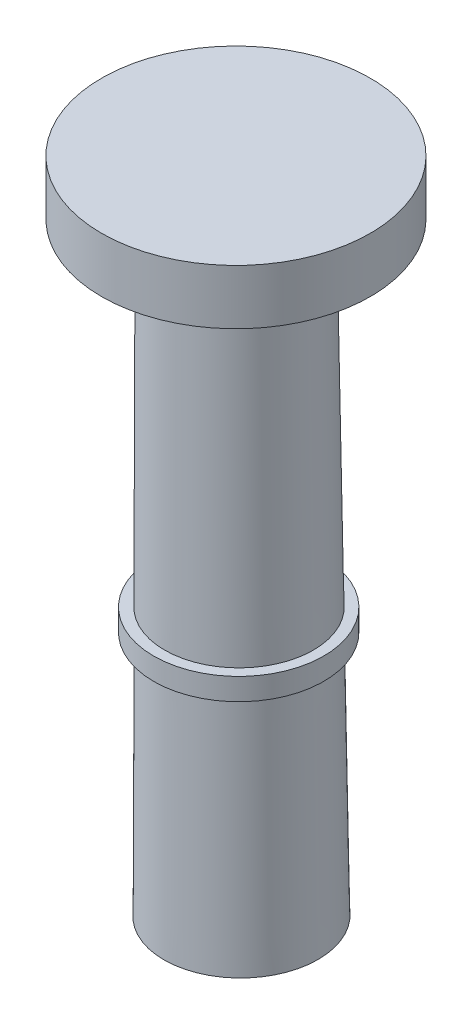
ISO-10303-21;
HEADER;
FILE_DESCRIPTION(('STEP AP214'),'2;1');
FILE_NAME('part.step','',(''),(''),'','','');
FILE_SCHEMA(('AUTOMOTIVE_DESIGN { 1 0 10303 214 1 1 1 1 }'));
ENDSEC;
DATA;
#1=APPLICATION_CONTEXT('core data for automotive mechanical design processes');
#2=APPLICATION_PROTOCOL_DEFINITION('international standard','automotive_design',2000,#1);
#3=PRODUCT_CONTEXT('',#1,'mechanical');
#4=PRODUCT('Part','Part','',(#3));
#5=PRODUCT_RELATED_PRODUCT_CATEGORY('part','',(#4));
#6=PRODUCT_DEFINITION_FORMATION('','',#4);
#7=PRODUCT_DEFINITION_CONTEXT('part definition',#1,'design');
#8=PRODUCT_DEFINITION('design','',#6,#7);
#9=PRODUCT_DEFINITION_SHAPE('','',#8);
#10=(LENGTH_UNIT() NAMED_UNIT(*) SI_UNIT(.MILLI.,.METRE.));
#11=(NAMED_UNIT(*) PLANE_ANGLE_UNIT() SI_UNIT($,.RADIAN.));
#12=(NAMED_UNIT(*) SI_UNIT($,.STERADIAN.) SOLID_ANGLE_UNIT());
#13=UNCERTAINTY_MEASURE_WITH_UNIT(LENGTH_MEASURE(1.E-05),#10,'distance_accuracy_value','');
#14=(GEOMETRIC_REPRESENTATION_CONTEXT(3) GLOBAL_UNCERTAINTY_ASSIGNED_CONTEXT((#13)) GLOBAL_UNIT_ASSIGNED_CONTEXT((#10,
#11,#12)) REPRESENTATION_CONTEXT('',''));
#15=CARTESIAN_POINT('',(0.,0.,0.));
#16=DIRECTION('',(0.,0.,1.));
#17=DIRECTION('',(1.,0.,0.));
#18=AXIS2_PLACEMENT_3D('',#15,#16,#17);
#19=CARTESIAN_POINT('',(-37.9943073576457,58.5449640366539,0.));
#20=DIRECTION('',(0.,-1.,0.));
#21=DIRECTION('',(0.,0.,-1.));
#22=AXIS2_PLACEMENT_3D('',#19,#20,#21);
#23=CYLINDRICAL_SURFACE('',#22,24.5);
#24=CARTESIAN_POINT('',(-37.9943073576457,58.5449640366539,0.));
#25=DIRECTION('',(0.,1.,0.));
#26=DIRECTION('',(0.,0.,1.));
#27=AXIS2_PLACEMENT_3D('',#24,#25,#26);
#28=CIRCLE('',#27,24.5);
#29=CARTESIAN_POINT('',(-37.9943073576457,58.5449640366539,24.5));
#30=VERTEX_POINT('',#29);
#31=EDGE_CURVE('E66',#30,#30,#28,.T.);
#32=ORIENTED_EDGE('',*,*,#31,.F.);
#33=EDGE_LOOP('',(#32));
#34=FACE_BOUND('',#33,.T.);
#35=CARTESIAN_POINT('',(-37.9943073576457,48.5449640366539,0.));
#36=DIRECTION('',(0.,1.,0.));
#37=DIRECTION('',(0.,0.,1.));
#38=AXIS2_PLACEMENT_3D('',#35,#36,#37);
#39=CIRCLE('',#38,24.5);
#40=CARTESIAN_POINT('',(-37.9943073576457,48.5449640366539,24.5));
#41=VERTEX_POINT('',#40);
#42=EDGE_CURVE('E69',#41,#41,#39,.T.);
#43=ORIENTED_EDGE('',*,*,#42,.T.);
#44=EDGE_LOOP('',(#43));
#45=FACE_BOUND('',#44,.T.);
#46=ADVANCED_FACE('F43',(#34,#45),#23,.T.);
#47=CARTESIAN_POINT('',(-37.9943073576457,58.5449640366539,0.));
#48=DIRECTION('',(0.,1.,0.));
#49=DIRECTION('',(0.,0.,1.));
#50=AXIS2_PLACEMENT_3D('',#47,#48,#49);
#51=PLANE('',#50);
#52=ORIENTED_EDGE('',*,*,#31,.T.);
#53=EDGE_LOOP('',(#52));
#54=FACE_BOUND('',#53,.T.);
#55=ADVANCED_FACE('F92',(#54),#51,.T.);
#56=CARTESIAN_POINT('',(-37.9943073576457,48.5449640366539,0.));
#57=DIRECTION('',(0.,1.,0.));
#58=DIRECTION('',(0.,0.,1.));
#59=AXIS2_PLACEMENT_3D('',#56,#57,#58);
#60=PLANE('',#59);
#61=CARTESIAN_POINT('',(-37.9900965974633,48.5449640366539,0.));
#62=DIRECTION('',(0.,1.,0.));
#63=DIRECTION('',(1.,0.,0.));
#64=AXIS2_PLACEMENT_3D('',#61,#62,#63);
#65=ELLIPSE('',#64,13.0042107601825,13.0036733849984);
#66=CARTESIAN_POINT('',(-24.9858858372808,48.5449640366539,0.));
#67=VERTEX_POINT('',#66);
#68=EDGE_CURVE('E62',#67,#67,#65,.F.);
#69=ORIENTED_EDGE('',*,*,#68,.F.);
#70=EDGE_LOOP('',(#69));
#71=FACE_BOUND('',#70,.T.);
#72=ORIENTED_EDGE('',*,*,#42,.F.);
#73=EDGE_LOOP('',(#72));
#74=FACE_BOUND('',#73,.T.);
#75=ADVANCED_FACE('F99',(#71,#74),#60,.F.);
#76=CARTESIAN_POINT('',(-37.9953816490266,49.0080996108008,0.));
#77=DIRECTION('',(0.0090905334567916,-0.999958680247075,0.));
#78=DIRECTION('',(0.999958680247075,0.0090905334567916,0.));
#79=AXIS2_PLACEMENT_3D('',#76,#77,#78);
#80=CONICAL_SURFACE('',#79,12.999462843212,0.00909065866505977);
#81=CARTESIAN_POINT('',(-37.435505308927,-12.4550359633461,0.));
#82=DIRECTION('',(0.,1.,0.));
#83=DIRECTION('',(1.,0.,0.));
#84=AXIS2_PLACEMENT_3D('',#81,#82,#83);
#85=ELLIPSE('',#84,13.5588020487187,13.5582417560658);
#86=CARTESIAN_POINT('',(-23.8767032602083,-12.4550359633461,0.));
#87=VERTEX_POINT('',#86);
#88=EDGE_CURVE('E11',#87,#87,#85,.F.);
#89=ORIENTED_EDGE('',*,*,#88,.F.);
#90=EDGE_LOOP('',(#89));
#91=FACE_BOUND('',#90,.T.);
#92=ORIENTED_EDGE('',*,*,#68,.T.);
#93=EDGE_LOOP('',(#92));
#94=FACE_BOUND('',#93,.T.);
#95=ADVANCED_FACE('F101',(#91,#94),#80,.T.);
#96=CARTESIAN_POINT('',(-37.4943073576457,-12.4550359633461,0.));
#97=DIRECTION('',(0.,-1.,0.));
#98=DIRECTION('',(0.,0.,-1.));
#99=AXIS2_PLACEMENT_3D('',#96,#97,#98);
#100=CYLINDRICAL_SURFACE('',#99,15.5);
#101=CARTESIAN_POINT('',(-37.4943073576457,-12.4550359633461,0.));
#102=DIRECTION('',(0.,1.,0.));
#103=DIRECTION('',(0.,0.,1.));
#104=AXIS2_PLACEMENT_3D('',#101,#102,#103);
#105=CIRCLE('',#104,15.5);
#106=CARTESIAN_POINT('',(-37.4943073576457,-12.4550359633461,15.5));
#107=VERTEX_POINT('',#106);
#108=EDGE_CURVE('E74',#107,#107,#105,.T.);
#109=ORIENTED_EDGE('',*,*,#108,.F.);
#110=EDGE_LOOP('',(#109));
#111=FACE_BOUND('',#110,.T.);
#112=CARTESIAN_POINT('',(-37.4943073576457,-16.4550359633461,0.));
#113=DIRECTION('',(0.,1.,0.));
#114=DIRECTION('',(0.,0.,1.));
#115=AXIS2_PLACEMENT_3D('',#112,#113,#114);
#116=CIRCLE('',#115,15.5);
#117=CARTESIAN_POINT('',(-37.4943073576457,-16.4550359633461,15.5));
#118=VERTEX_POINT('',#117);
#119=EDGE_CURVE('E81',#118,#118,#116,.T.);
#120=ORIENTED_EDGE('',*,*,#119,.T.);
#121=EDGE_LOOP('',(#120));
#122=FACE_BOUND('',#121,.T.);
#123=ADVANCED_FACE('F108',(#111,#122),#100,.T.);
#124=CARTESIAN_POINT('',(-37.4943073576457,-12.4550359633461,0.));
#125=DIRECTION('',(0.,1.,0.));
#126=DIRECTION('',(0.,0.,1.));
#127=AXIS2_PLACEMENT_3D('',#124,#125,#126);
#128=PLANE('',#127);
#129=ORIENTED_EDGE('',*,*,#88,.T.);
#130=EDGE_LOOP('',(#129));
#131=FACE_BOUND('',#130,.T.);
#132=ORIENTED_EDGE('',*,*,#108,.T.);
#133=EDGE_LOOP('',(#132));
#134=FACE_BOUND('',#133,.T.);
#135=ADVANCED_FACE('F115',(#131,#134),#128,.T.);
#136=CARTESIAN_POINT('',(-37.4943073576457,-16.4550359633461,0.));
#137=DIRECTION('',(0.,1.,0.));
#138=DIRECTION('',(0.,0.,1.));
#139=AXIS2_PLACEMENT_3D('',#136,#137,#138);
#140=PLANE('',#139);
#141=CARTESIAN_POINT('',(-37.3991386670558,-16.4550359633461,0.));
#142=DIRECTION('',(0.,1.,0.));
#143=DIRECTION('',(1.,0.,0.));
#144=AXIS2_PLACEMENT_3D('',#141,#142,#143);
#145=ELLIPSE('',#144,13.5951686905899,13.5946068951522);
#146=CARTESIAN_POINT('',(-23.8039699764659,-16.4550359633461,0.));
#147=VERTEX_POINT('',#146);
#148=EDGE_CURVE('E71',#147,#147,#145,.F.);
#149=ORIENTED_EDGE('',*,*,#148,.F.);
#150=EDGE_LOOP('',(#149));
#151=FACE_BOUND('',#150,.T.);
#152=ORIENTED_EDGE('',*,*,#119,.F.);
#153=EDGE_LOOP('',(#152));
#154=FACE_BOUND('',#153,.T.);
#155=ADVANCED_FACE('F57',(#151,#154),#140,.F.);
#156=CARTESIAN_POINT('',(-36.9954642868251,-60.982810231361,0.));
#157=DIRECTION('',(-0.0090905334567916,0.999958680247075,0.));
#158=DIRECTION('',(-0.999958680247075,-0.0090905334567916,0.));
#159=AXIS2_PLACEMENT_3D('',#156,#157,#158);
#160=CONICAL_SURFACE('',#159,13.999421523459,1.56170566812984);
#161=CARTESIAN_POINT('',(-36.9943073576457,-61.1100724410957,0.));
#162=VERTEX_POINT('',#161);
#163=VERTEX_LOOP('',#162);
#164=FACE_BOUND('',#163,.T.);
#165=CARTESIAN_POINT('',(-36.9954642868251,-60.982810231361,0.));
#166=DIRECTION('',(-0.0090905334567916,0.999958680247075,0.));
#167=DIRECTION('',(-0.999958680247075,-0.0090905334567916,0.));
#168=AXIS2_PLACEMENT_3D('',#165,#166,#167);
#169=CIRCLE('',#168,13.999421523459);
#170=CARTESIAN_POINT('',(-50.9943073576457,-61.1100724410957,0.));
#171=VERTEX_POINT('',#170);
#172=EDGE_CURVE('E51',#171,#171,#169,.T.);
#173=ORIENTED_EDGE('',*,*,#172,.F.);
#174=EDGE_LOOP('',(#173));
#175=FACE_BOUND('',#174,.T.);
#176=ADVANCED_FACE('F45',(#164,#175),#160,.T.);
#177=ORIENTED_EDGE('',*,*,#172,.T.);
#178=EDGE_LOOP('',(#177));
#179=FACE_BOUND('',#178,.T.);
#180=ORIENTED_EDGE('',*,*,#148,.T.);
#181=EDGE_LOOP('',(#180));
#182=FACE_BOUND('',#181,.T.);
#183=ADVANCED_FACE('F56',(#179,#182),#80,.T.);
#184=CLOSED_SHELL('',(#46,#55,#75,#95,#123,#135,#155,#176,#183));
#185=MANIFOLD_SOLID_BREP('B2',#184);
#186=ADVANCED_BREP_SHAPE_REPRESENTATION('',(#18,#185),#14);
#187=SHAPE_DEFINITION_REPRESENTATION(#9,#186);
ENDSEC;
END-ISO-10303-21;
